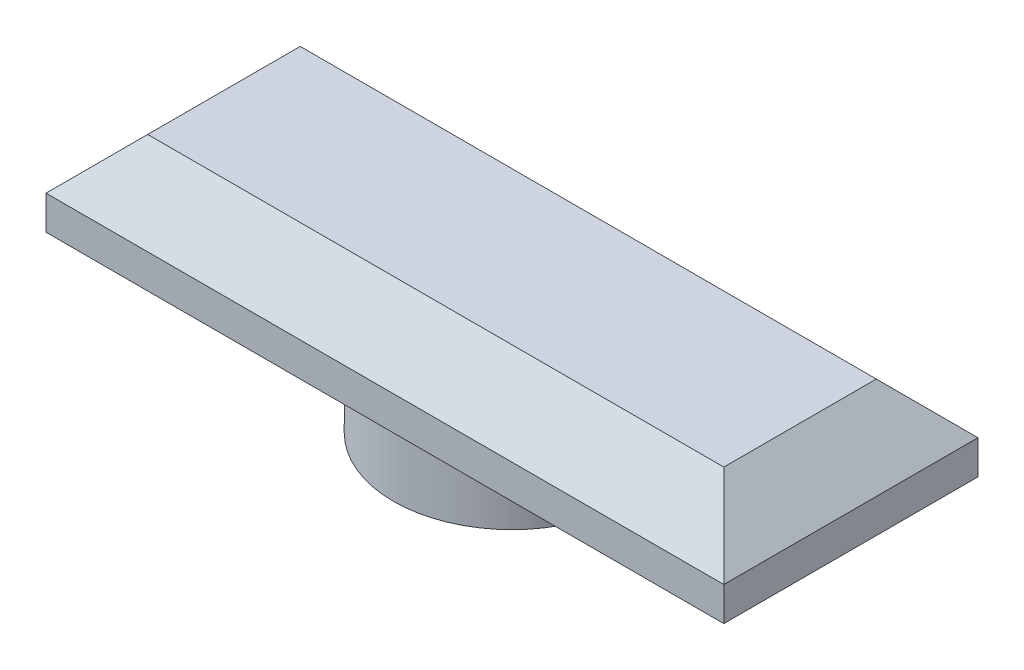
ISO-10303-21;
HEADER;
FILE_DESCRIPTION(('STEP AP214'),'2;1');
FILE_NAME('part.step','',(''),(''),'','','');
FILE_SCHEMA(('AUTOMOTIVE_DESIGN { 1 0 10303 214 1 1 1 1 }'));
ENDSEC;
DATA;
#1=APPLICATION_CONTEXT('core data for automotive mechanical design processes');
#2=APPLICATION_PROTOCOL_DEFINITION('international standard','automotive_design',2000,#1);
#3=PRODUCT_CONTEXT('',#1,'mechanical');
#4=PRODUCT('Part','Part','',(#3));
#5=PRODUCT_RELATED_PRODUCT_CATEGORY('part','',(#4));
#6=PRODUCT_DEFINITION_FORMATION('','',#4);
#7=PRODUCT_DEFINITION_CONTEXT('part definition',#1,'design');
#8=PRODUCT_DEFINITION('design','',#6,#7);
#9=PRODUCT_DEFINITION_SHAPE('','',#8);
#10=(LENGTH_UNIT() NAMED_UNIT(*) SI_UNIT(.MILLI.,.METRE.));
#11=(NAMED_UNIT(*) PLANE_ANGLE_UNIT() SI_UNIT($,.RADIAN.));
#12=(NAMED_UNIT(*) SI_UNIT($,.STERADIAN.) SOLID_ANGLE_UNIT());
#13=UNCERTAINTY_MEASURE_WITH_UNIT(LENGTH_MEASURE(1.E-05),#10,'distance_accuracy_value','');
#14=(GEOMETRIC_REPRESENTATION_CONTEXT(3) GLOBAL_UNCERTAINTY_ASSIGNED_CONTEXT((#13)) GLOBAL_UNIT_ASSIGNED_CONTEXT((#10,
#11,#12)) REPRESENTATION_CONTEXT('',''));
#15=CARTESIAN_POINT('',(0.,0.,0.));
#16=DIRECTION('',(0.,0.,1.));
#17=DIRECTION('',(1.,0.,0.));
#18=AXIS2_PLACEMENT_3D('',#15,#16,#17);
#19=CARTESIAN_POINT('',(20.,9.,-7.5));
#20=DIRECTION('',(-1.,0.,0.));
#21=DIRECTION('',(0.,0.,1.));
#22=AXIS2_PLACEMENT_3D('',#19,#20,#21);
#23=PLANE('',#22);
#24=DIRECTION('',(0.,-1.,0.));
#25=VECTOR('',#24,1.);
#26=CARTESIAN_POINT('',(20.,9.,-7.5));
#27=LINE('',#26,#25);
#28=CARTESIAN_POINT('',(20.,5.99999999999999,-7.5));
#29=VERTEX_POINT('',#28);
#30=CARTESIAN_POINT('',(20.,4.,-7.5));
#31=VERTEX_POINT('',#30);
#32=EDGE_CURVE('E94',#29,#31,#27,.T.);
#33=ORIENTED_EDGE('',*,*,#32,.F.);
#34=DIRECTION('',(0.,0.,1.));
#35=VECTOR('',#34,1.);
#36=CARTESIAN_POINT('',(20.,5.99999999999999,7.5));
#37=LINE('',#36,#35);
#38=CARTESIAN_POINT('',(20.,5.99999999999999,7.5));
#39=VERTEX_POINT('',#38);
#40=EDGE_CURVE('E141',#29,#39,#37,.T.);
#41=ORIENTED_EDGE('',*,*,#40,.T.);
#42=DIRECTION('',(0.,-1.,0.));
#43=VECTOR('',#42,1.);
#44=CARTESIAN_POINT('',(20.,9.,7.5));
#45=LINE('',#44,#43);
#46=CARTESIAN_POINT('',(20.,4.,7.5));
#47=VERTEX_POINT('',#46);
#48=EDGE_CURVE('E116',#39,#47,#45,.T.);
#49=ORIENTED_EDGE('',*,*,#48,.T.);
#50=DIRECTION('',(0.,0.,-1.));
#51=VECTOR('',#50,1.);
#52=CARTESIAN_POINT('',(20.,4.,-7.5));
#53=LINE('',#52,#51);
#54=EDGE_CURVE('E112',#47,#31,#53,.T.);
#55=ORIENTED_EDGE('',*,*,#54,.T.);
#56=EDGE_LOOP('',(#33,#41,#49,#55));
#57=FACE_BOUND('',#56,.T.);
#58=ADVANCED_FACE('F40',(#57),#23,.F.);
#59=CARTESIAN_POINT('',(-20.,9.,-7.5));
#60=DIRECTION('',(0.,0.,1.));
#61=DIRECTION('',(1.,0.,0.));
#62=AXIS2_PLACEMENT_3D('',#59,#60,#61);
#63=PLANE('',#62);
#64=DIRECTION('',(0.,-1.,0.));
#65=VECTOR('',#64,1.);
#66=CARTESIAN_POINT('',(-20.,9.,-7.5));
#67=LINE('',#66,#65);
#68=CARTESIAN_POINT('',(-20.,5.99999999999999,-7.5));
#69=VERTEX_POINT('',#68);
#70=CARTESIAN_POINT('',(-20.,4.,-7.5));
#71=VERTEX_POINT('',#70);
#72=EDGE_CURVE('E106',#69,#71,#67,.T.);
#73=ORIENTED_EDGE('',*,*,#72,.F.);
#74=DIRECTION('',(1.,0.,0.));
#75=VECTOR('',#74,1.);
#76=CARTESIAN_POINT('',(20.,5.99999999999999,-7.5));
#77=LINE('',#76,#75);
#78=EDGE_CURVE('E100',#69,#29,#77,.T.);
#79=ORIENTED_EDGE('',*,*,#78,.T.);
#80=ORIENTED_EDGE('',*,*,#32,.T.);
#81=DIRECTION('',(-1.,0.,0.));
#82=VECTOR('',#81,1.);
#83=CARTESIAN_POINT('',(-20.,4.,-7.5));
#84=LINE('',#83,#82);
#85=EDGE_CURVE('E97',#31,#71,#84,.T.);
#86=ORIENTED_EDGE('',*,*,#85,.T.);
#87=EDGE_LOOP('',(#73,#79,#80,#86));
#88=FACE_BOUND('',#87,.T.);
#89=ADVANCED_FACE('F96',(#88),#63,.F.);
#90=CARTESIAN_POINT('',(-20.,9.,-7.5));
#91=DIRECTION('',(1.,0.,0.));
#92=DIRECTION('',(0.,0.,-1.));
#93=AXIS2_PLACEMENT_3D('',#90,#91,#92);
#94=PLANE('',#93);
#95=DIRECTION('',(0.,-1.,0.));
#96=VECTOR('',#95,1.);
#97=CARTESIAN_POINT('',(-20.,9.,7.5));
#98=LINE('',#97,#96);
#99=CARTESIAN_POINT('',(-20.,5.99999999999999,7.5));
#100=VERTEX_POINT('',#99);
#101=CARTESIAN_POINT('',(-20.,4.,7.5));
#102=VERTEX_POINT('',#101);
#103=EDGE_CURVE('E130',#100,#102,#98,.T.);
#104=ORIENTED_EDGE('',*,*,#103,.F.);
#105=DIRECTION('',(0.,0.,-1.));
#106=VECTOR('',#105,1.);
#107=CARTESIAN_POINT('',(-20.,5.99999999999999,-7.5));
#108=LINE('',#107,#106);
#109=EDGE_CURVE('E62',#100,#69,#108,.T.);
#110=ORIENTED_EDGE('',*,*,#109,.T.);
#111=ORIENTED_EDGE('',*,*,#72,.T.);
#112=DIRECTION('',(0.,0.,1.));
#113=VECTOR('',#112,1.);
#114=CARTESIAN_POINT('',(-20.,4.,-7.5));
#115=LINE('',#114,#113);
#116=EDGE_CURVE('E114',#71,#102,#115,.T.);
#117=ORIENTED_EDGE('',*,*,#116,.T.);
#118=EDGE_LOOP('',(#104,#110,#111,#117));
#119=FACE_BOUND('',#118,.T.);
#120=ADVANCED_FACE('F167',(#119),#94,.F.);
#121=CARTESIAN_POINT('',(-20.,9.,7.5));
#122=DIRECTION('',(0.,0.,-1.));
#123=DIRECTION('',(-1.,0.,0.));
#124=AXIS2_PLACEMENT_3D('',#121,#122,#123);
#125=PLANE('',#124);
#126=ORIENTED_EDGE('',*,*,#48,.F.);
#127=DIRECTION('',(-1.,0.,0.));
#128=VECTOR('',#127,1.);
#129=CARTESIAN_POINT('',(-20.,5.99999999999999,7.5));
#130=LINE('',#129,#128);
#131=EDGE_CURVE('E49',#39,#100,#130,.T.);
#132=ORIENTED_EDGE('',*,*,#131,.T.);
#133=ORIENTED_EDGE('',*,*,#103,.T.);
#134=DIRECTION('',(1.,0.,0.));
#135=VECTOR('',#134,1.);
#136=CARTESIAN_POINT('',(-20.,4.,7.5));
#137=LINE('',#136,#135);
#138=EDGE_CURVE('E127',#102,#47,#137,.T.);
#139=ORIENTED_EDGE('',*,*,#138,.T.);
#140=EDGE_LOOP('',(#126,#132,#133,#139));
#141=FACE_BOUND('',#140,.T.);
#142=ADVANCED_FACE('F166',(#141),#125,.F.);
#143=CARTESIAN_POINT('',(0.,9.,0.));
#144=DIRECTION('',(0.,1.,0.));
#145=DIRECTION('',(0.,0.,1.));
#146=AXIS2_PLACEMENT_3D('',#143,#144,#145);
#147=PLANE('',#146);
#148=DIRECTION('',(1.,0.,0.));
#149=VECTOR('',#148,1.);
#150=CARTESIAN_POINT('',(20.,9.,4.5));
#151=LINE('',#150,#149);
#152=CARTESIAN_POINT('',(-17.,9.,4.5));
#153=VERTEX_POINT('',#152);
#154=CARTESIAN_POINT('',(17.,9.,4.5));
#155=VERTEX_POINT('',#154);
#156=EDGE_CURVE('E105',#153,#155,#151,.T.);
#157=ORIENTED_EDGE('',*,*,#156,.T.);
#158=DIRECTION('',(0.,0.,-1.));
#159=VECTOR('',#158,1.);
#160=CARTESIAN_POINT('',(17.,9.,-7.5));
#161=LINE('',#160,#159);
#162=CARTESIAN_POINT('',(17.,9.,-4.5));
#163=VERTEX_POINT('',#162);
#164=EDGE_CURVE('E138',#155,#163,#161,.T.);
#165=ORIENTED_EDGE('',*,*,#164,.T.);
#166=DIRECTION('',(-1.,0.,0.));
#167=VECTOR('',#166,1.);
#168=CARTESIAN_POINT('',(-20.,9.,-4.5));
#169=LINE('',#168,#167);
#170=CARTESIAN_POINT('',(-17.,9.,-4.5));
#171=VERTEX_POINT('',#170);
#172=EDGE_CURVE('E136',#163,#171,#169,.T.);
#173=ORIENTED_EDGE('',*,*,#172,.T.);
#174=DIRECTION('',(0.,0.,1.));
#175=VECTOR('',#174,1.);
#176=CARTESIAN_POINT('',(-17.,9.,7.5));
#177=LINE('',#176,#175);
#178=EDGE_CURVE('E134',#171,#153,#177,.T.);
#179=ORIENTED_EDGE('',*,*,#178,.T.);
#180=EDGE_LOOP('',(#157,#165,#173,#179));
#181=FACE_BOUND('',#180,.T.);
#182=ADVANCED_FACE('F161',(#181),#147,.T.);
#183=CARTESIAN_POINT('',(0.,4.,0.));
#184=DIRECTION('',(0.,1.,0.));
#185=DIRECTION('',(0.,0.,1.));
#186=AXIS2_PLACEMENT_3D('',#183,#184,#185);
#187=PLANE('',#186);
#188=CARTESIAN_POINT('',(0.,4.,0.));
#189=DIRECTION('',(0.,1.,0.));
#190=DIRECTION('',(0.,0.,1.));
#191=AXIS2_PLACEMENT_3D('',#188,#189,#190);
#192=CIRCLE('',#191,7.);
#193=CARTESIAN_POINT('',(0.,4.,7.));
#194=VERTEX_POINT('',#193);
#195=EDGE_CURVE('E11',#194,#194,#192,.F.);
#196=ORIENTED_EDGE('',*,*,#195,.F.);
#197=EDGE_LOOP('',(#196));
#198=FACE_BOUND('',#197,.T.);
#199=ORIENTED_EDGE('',*,*,#54,.F.);
#200=ORIENTED_EDGE('',*,*,#138,.F.);
#201=ORIENTED_EDGE('',*,*,#116,.F.);
#202=ORIENTED_EDGE('',*,*,#85,.F.);
#203=EDGE_LOOP('',(#199,#200,#201,#202));
#204=FACE_BOUND('',#203,.T.);
#205=ADVANCED_FACE('F110',(#198,#204),#187,.F.);
#206=CARTESIAN_POINT('',(-17.,9.,0.));
#207=DIRECTION('',(-0.707106781186549,0.707106781186546,0.));
#208=DIRECTION('',(0.,0.,-1.));
#209=AXIS2_PLACEMENT_3D('',#206,#207,#208);
#210=PLANE('',#209);
#211=DIRECTION('',(-0.577350269189625,-0.577350269189627,-0.577350269189625));
#212=VECTOR('',#211,1.);
#213=CARTESIAN_POINT('',(-15.5,10.5,-3.00000000000001));
#214=LINE('',#213,#212);
#215=EDGE_CURVE('E121',#69,#171,#214,.F.);
#216=ORIENTED_EDGE('',*,*,#215,.F.);
#217=ORIENTED_EDGE('',*,*,#109,.F.);
#218=DIRECTION('',(-0.577350269189625,-0.577350269189627,0.577350269189625));
#219=VECTOR('',#218,1.);
#220=CARTESIAN_POINT('',(-11.3333333333333,14.6666666666667,-1.16666666666665));
#221=LINE('',#220,#219);
#222=EDGE_CURVE('E118',#153,#100,#221,.T.);
#223=ORIENTED_EDGE('',*,*,#222,.F.);
#224=ORIENTED_EDGE('',*,*,#178,.F.);
#225=EDGE_LOOP('',(#216,#217,#223,#224));
#226=FACE_BOUND('',#225,.T.);
#227=ADVANCED_FACE('F43',(#226),#210,.T.);
#228=CARTESIAN_POINT('',(0.,9.,4.5));
#229=DIRECTION('',(0.,0.707106781186546,0.707106781186549));
#230=DIRECTION('',(-1.,0.,0.));
#231=AXIS2_PLACEMENT_3D('',#228,#229,#230);
#232=PLANE('',#231);
#233=ORIENTED_EDGE('',*,*,#222,.T.);
#234=ORIENTED_EDGE('',*,*,#131,.F.);
#235=DIRECTION('',(-0.577350269189625,0.577350269189628,-0.577350269189625));
#236=VECTOR('',#235,1.);
#237=CARTESIAN_POINT('',(11.3333333333334,14.6666666666667,-1.16666666666665));
#238=LINE('',#237,#236);
#239=EDGE_CURVE('E148',#155,#39,#238,.F.);
#240=ORIENTED_EDGE('',*,*,#239,.F.);
#241=ORIENTED_EDGE('',*,*,#156,.F.);
#242=EDGE_LOOP('',(#233,#234,#240,#241));
#243=FACE_BOUND('',#242,.T.);
#244=ADVANCED_FACE('F192',(#243),#232,.T.);
#245=CARTESIAN_POINT('',(0.,9.,-4.5));
#246=DIRECTION('',(0.,0.707106781186546,-0.707106781186549));
#247=DIRECTION('',(1.,0.,0.));
#248=AXIS2_PLACEMENT_3D('',#245,#246,#247);
#249=PLANE('',#248);
#250=ORIENTED_EDGE('',*,*,#215,.T.);
#251=ORIENTED_EDGE('',*,*,#172,.F.);
#252=DIRECTION('',(0.577350269189625,-0.577350269189628,-0.577350269189625));
#253=VECTOR('',#252,1.);
#254=CARTESIAN_POINT('',(11.3333333333334,14.6666666666667,1.16666666666665));
#255=LINE('',#254,#253);
#256=EDGE_CURVE('E146',#29,#163,#255,.F.);
#257=ORIENTED_EDGE('',*,*,#256,.F.);
#258=ORIENTED_EDGE('',*,*,#78,.F.);
#259=EDGE_LOOP('',(#250,#251,#257,#258));
#260=FACE_BOUND('',#259,.T.);
#261=ADVANCED_FACE('F154',(#260),#249,.T.);
#262=CARTESIAN_POINT('',(17.,9.,0.));
#263=DIRECTION('',(0.707106781186549,0.707106781186546,0.));
#264=DIRECTION('',(0.,0.,1.));
#265=AXIS2_PLACEMENT_3D('',#262,#263,#264);
#266=PLANE('',#265);
#267=ORIENTED_EDGE('',*,*,#239,.T.);
#268=ORIENTED_EDGE('',*,*,#40,.F.);
#269=ORIENTED_EDGE('',*,*,#256,.T.);
#270=ORIENTED_EDGE('',*,*,#164,.F.);
#271=EDGE_LOOP('',(#267,#268,#269,#270));
#272=FACE_BOUND('',#271,.T.);
#273=ADVANCED_FACE('F165',(#272),#266,.T.);
#274=CARTESIAN_POINT('',(0.,0.,0.));
#275=DIRECTION('',(0.,-1.,0.));
#276=DIRECTION('',(0.,0.,-1.));
#277=AXIS2_PLACEMENT_3D('',#274,#275,#276);
#278=PLANE('',#277);
#279=CARTESIAN_POINT('',(0.,0.,0.));
#280=DIRECTION('',(0.,-1.,0.));
#281=DIRECTION('',(0.,0.,-1.));
#282=AXIS2_PLACEMENT_3D('',#279,#280,#281);
#283=CIRCLE('',#282,7.);
#284=CARTESIAN_POINT('',(0.,0.,-7.));
#285=VERTEX_POINT('',#284);
#286=EDGE_CURVE('E123',#285,#285,#283,.T.);
#287=ORIENTED_EDGE('',*,*,#286,.T.);
#288=EDGE_LOOP('',(#287));
#289=FACE_BOUND('',#288,.T.);
#290=CARTESIAN_POINT('',(0.,0.,0.));
#291=DIRECTION('',(0.,-1.,0.));
#292=DIRECTION('',(0.,0.,-1.));
#293=AXIS2_PLACEMENT_3D('',#290,#291,#292);
#294=CIRCLE('',#293,6.);
#295=CARTESIAN_POINT('',(0.,0.,-6.));
#296=VERTEX_POINT('',#295);
#297=EDGE_CURVE('E224',#296,#296,#294,.T.);
#298=ORIENTED_EDGE('',*,*,#297,.F.);
#299=EDGE_LOOP('',(#298));
#300=FACE_BOUND('',#299,.T.);
#301=ADVANCED_FACE('F187',(#289,#300),#278,.T.);
#302=CARTESIAN_POINT('',(0.,0.,0.));
#303=DIRECTION('',(0.,1.,0.));
#304=DIRECTION('',(0.,0.,1.));
#305=AXIS2_PLACEMENT_3D('',#302,#303,#304);
#306=CYLINDRICAL_SURFACE('',#305,7.);
#307=ORIENTED_EDGE('',*,*,#286,.F.);
#308=EDGE_LOOP('',(#307));
#309=FACE_BOUND('',#308,.T.);
#310=ORIENTED_EDGE('',*,*,#195,.T.);
#311=EDGE_LOOP('',(#310));
#312=FACE_BOUND('',#311,.T.);
#313=ADVANCED_FACE('F217',(#309,#312),#306,.T.);
#314=CARTESIAN_POINT('',(0.,0.,0.));
#315=DIRECTION('',(0.,1.,0.));
#316=DIRECTION('',(0.,0.,1.));
#317=AXIS2_PLACEMENT_3D('',#314,#315,#316);
#318=CYLINDRICAL_SURFACE('',#317,6.);
#319=ORIENTED_EDGE('',*,*,#297,.T.);
#320=EDGE_LOOP('',(#319));
#321=FACE_BOUND('',#320,.T.);
#322=CARTESIAN_POINT('',(0.,4.,0.));
#323=DIRECTION('',(0.,-1.,0.));
#324=DIRECTION('',(0.,0.,-1.));
#325=AXIS2_PLACEMENT_3D('',#322,#323,#324);
#326=CIRCLE('',#325,6.);
#327=CARTESIAN_POINT('',(0.,4.,-6.));
#328=VERTEX_POINT('',#327);
#329=EDGE_CURVE('E222',#328,#328,#326,.T.);
#330=ORIENTED_EDGE('',*,*,#329,.F.);
#331=EDGE_LOOP('',(#330));
#332=FACE_BOUND('',#331,.T.);
#333=ADVANCED_FACE('F212',(#321,#332),#318,.F.);
#334=ORIENTED_EDGE('',*,*,#329,.T.);
#335=EDGE_LOOP('',(#334));
#336=FACE_BOUND('',#335,.T.);
#337=ADVANCED_FACE('F205',(#336),#187,.F.);
#338=CLOSED_SHELL('',(#58,#89,#120,#142,#182,#205,#227,#244,#261,#273,#301,#313,#333,#337));
#339=MANIFOLD_SOLID_BREP('B2',#338);
#340=ADVANCED_BREP_SHAPE_REPRESENTATION('',(#18,#339),#14);
#341=SHAPE_DEFINITION_REPRESENTATION(#9,#340);
ENDSEC;
END-ISO-10303-21;
